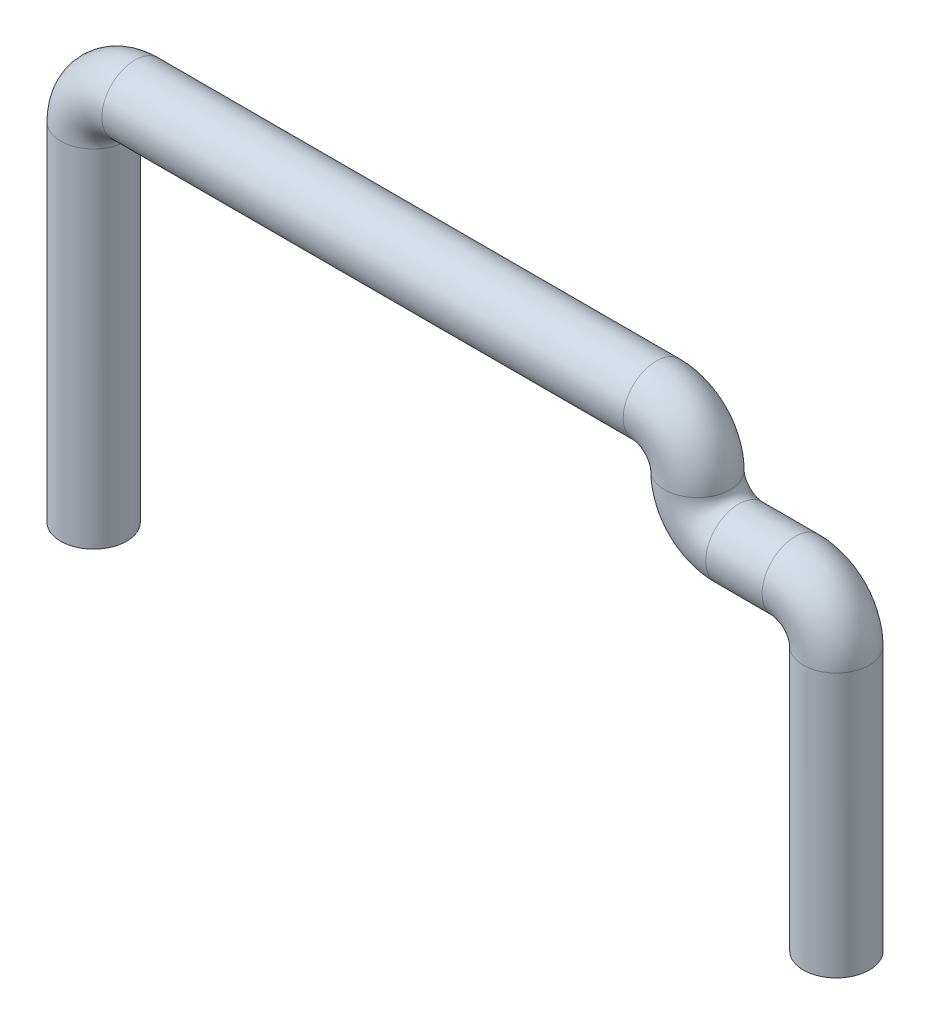
ISO-10303-21;
HEADER;
FILE_DESCRIPTION(('STEP AP214'),'2;1');
FILE_NAME('part.step','',(''),(''),'','','');
FILE_SCHEMA(('AUTOMOTIVE_DESIGN { 1 0 10303 214 1 1 1 1 }'));
ENDSEC;
DATA;
#1=APPLICATION_CONTEXT('core data for automotive mechanical design processes');
#2=APPLICATION_PROTOCOL_DEFINITION('international standard','automotive_design',2000,#1);
#3=PRODUCT_CONTEXT('',#1,'mechanical');
#4=PRODUCT('Part','Part','',(#3));
#5=PRODUCT_RELATED_PRODUCT_CATEGORY('part','',(#4));
#6=PRODUCT_DEFINITION_FORMATION('','',#4);
#7=PRODUCT_DEFINITION_CONTEXT('part definition',#1,'design');
#8=PRODUCT_DEFINITION('design','',#6,#7);
#9=PRODUCT_DEFINITION_SHAPE('','',#8);
#10=(LENGTH_UNIT() NAMED_UNIT(*) SI_UNIT(.MILLI.,.METRE.));
#11=(NAMED_UNIT(*) PLANE_ANGLE_UNIT() SI_UNIT($,.RADIAN.));
#12=(NAMED_UNIT(*) SI_UNIT($,.STERADIAN.) SOLID_ANGLE_UNIT());
#13=UNCERTAINTY_MEASURE_WITH_UNIT(LENGTH_MEASURE(1.E-05),#10,'distance_accuracy_value','');
#14=(GEOMETRIC_REPRESENTATION_CONTEXT(3) GLOBAL_UNCERTAINTY_ASSIGNED_CONTEXT((#13)) GLOBAL_UNIT_ASSIGNED_CONTEXT((#10,
#11,#12)) REPRESENTATION_CONTEXT('',''));
#15=CARTESIAN_POINT('',(0.,0.,0.));
#16=DIRECTION('',(0.,0.,1.));
#17=DIRECTION('',(1.,0.,0.));
#18=AXIS2_PLACEMENT_3D('',#15,#16,#17);
#19=CARTESIAN_POINT('',(3.17080544439415,0.,0.));
#20=DIRECTION('',(0.,1.,0.));
#21=DIRECTION('',(0.,0.,1.));
#22=AXIS2_PLACEMENT_3D('',#19,#20,#21);
#23=PLANE('',#22);
#24=CARTESIAN_POINT('',(3.17080544439415,0.,0.));
#25=DIRECTION('',(0.,-1.,0.));
#26=DIRECTION('',(0.,0.,-1.));
#27=AXIS2_PLACEMENT_3D('',#24,#25,#26);
#28=CIRCLE('',#27,0.4);
#29=CARTESIAN_POINT('',(3.17080544439415,0.,-0.4));
#30=VERTEX_POINT('',#29);
#31=EDGE_CURVE('E18',#30,#30,#28,.F.);
#32=ORIENTED_EDGE('',*,*,#31,.F.);
#33=EDGE_LOOP('',(#32));
#34=FACE_BOUND('',#33,.T.);
#35=ADVANCED_FACE('F15',(#34),#23,.F.);
#36=CARTESIAN_POINT('',(3.17080544439415,3.2,0.));
#37=DIRECTION('',(0.,-1.,0.));
#38=DIRECTION('',(0.,0.,-1.));
#39=AXIS2_PLACEMENT_3D('',#36,#37,#38);
#40=CYLINDRICAL_SURFACE('',#39,0.4);
#41=CARTESIAN_POINT('',(3.17080544439415,3.2,0.));
#42=DIRECTION('',(0.,-1.,0.));
#43=DIRECTION('',(1.,0.,0.));
#44=AXIS2_PLACEMENT_3D('',#41,#42,#43);
#45=CIRCLE('',#44,0.4);
#46=CARTESIAN_POINT('',(3.57080544439415,3.2,0.));
#47=VERTEX_POINT('',#46);
#48=EDGE_CURVE('E92',#47,#47,#45,.F.);
#49=ORIENTED_EDGE('',*,*,#48,.F.);
#50=EDGE_LOOP('',(#49));
#51=FACE_BOUND('',#50,.T.);
#52=ORIENTED_EDGE('',*,*,#31,.T.);
#53=EDGE_LOOP('',(#52));
#54=FACE_BOUND('',#53,.T.);
#55=ADVANCED_FACE('F85',(#51,#54),#40,.T.);
#56=CARTESIAN_POINT('',(2.67080544439415,3.2,0.));
#57=DIRECTION('',(0.,0.,-1.));
#58=DIRECTION('',(-1.,0.,0.));
#59=AXIS2_PLACEMENT_3D('',#56,#57,#58);
#60=TOROIDAL_SURFACE('',#59,0.5,0.4);
#61=CARTESIAN_POINT('',(2.67080544439415,3.7,0.));
#62=DIRECTION('',(1.,0.,0.));
#63=DIRECTION('',(0.,1.,0.));
#64=AXIS2_PLACEMENT_3D('',#61,#62,#63);
#65=CIRCLE('',#64,0.4);
#66=CARTESIAN_POINT('',(2.67080544439415,4.1,0.));
#67=VERTEX_POINT('',#66);
#68=EDGE_CURVE('E96',#67,#67,#65,.F.);
#69=ORIENTED_EDGE('',*,*,#68,.F.);
#70=EDGE_LOOP('',(#69));
#71=FACE_BOUND('',#70,.T.);
#72=ORIENTED_EDGE('',*,*,#48,.T.);
#73=EDGE_LOOP('',(#72));
#74=FACE_BOUND('',#73,.T.);
#75=ADVANCED_FACE('F81',(#71,#74),#60,.T.);
#76=CARTESIAN_POINT('',(1.98756574697502,3.7,0.));
#77=DIRECTION('',(1.,0.,0.));
#78=DIRECTION('',(0.,1.,0.));
#79=AXIS2_PLACEMENT_3D('',#76,#77,#78);
#80=CYLINDRICAL_SURFACE('',#79,0.4);
#81=CARTESIAN_POINT('',(1.98756574697501,3.7,0.));
#82=DIRECTION('',(1.,0.,0.));
#83=DIRECTION('',(0.,-1.,0.));
#84=AXIS2_PLACEMENT_3D('',#81,#82,#83);
#85=CIRCLE('',#84,0.4);
#86=CARTESIAN_POINT('',(1.987565746975,3.3,0.));
#87=VERTEX_POINT('',#86);
#88=EDGE_CURVE('E68',#87,#87,#85,.F.);
#89=ORIENTED_EDGE('',*,*,#88,.F.);
#90=EDGE_LOOP('',(#89));
#91=FACE_BOUND('',#90,.T.);
#92=ORIENTED_EDGE('',*,*,#68,.T.);
#93=EDGE_LOOP('',(#92));
#94=FACE_BOUND('',#93,.T.);
#95=ADVANCED_FACE('F77',(#91,#94),#80,.T.);
#96=CARTESIAN_POINT('',(-5.82919455560585,0.,0.));
#97=DIRECTION('',(0.,-1.,0.));
#98=DIRECTION('',(0.,0.,-1.));
#99=AXIS2_PLACEMENT_3D('',#96,#97,#98);
#100=PLANE('',#99);
#101=CARTESIAN_POINT('',(-5.82919455560585,0.,0.));
#102=DIRECTION('',(0.,1.,0.));
#103=DIRECTION('',(0.,0.,1.));
#104=AXIS2_PLACEMENT_3D('',#101,#102,#103);
#105=CIRCLE('',#104,0.4);
#106=CARTESIAN_POINT('',(-5.82919455560585,0.,0.4));
#107=VERTEX_POINT('',#106);
#108=EDGE_CURVE('E63',#107,#107,#105,.T.);
#109=ORIENTED_EDGE('',*,*,#108,.F.);
#110=EDGE_LOOP('',(#109));
#111=FACE_BOUND('',#110,.T.);
#112=ADVANCED_FACE('F73',(#111),#100,.T.);
#113=CARTESIAN_POINT('',(1.98756574697502,4.2,0.));
#114=DIRECTION('',(0.,0.,1.));
#115=DIRECTION('',(1.,0.,0.));
#116=AXIS2_PLACEMENT_3D('',#113,#114,#115);
#117=TOROIDAL_SURFACE('',#116,0.5,0.4);
#118=CARTESIAN_POINT('',(1.48756574697502,4.2,0.));
#119=DIRECTION('',(0.,-1.,0.));
#120=DIRECTION('',(1.,0.,0.));
#121=AXIS2_PLACEMENT_3D('',#118,#119,#120);
#122=CIRCLE('',#121,0.4);
#123=CARTESIAN_POINT('',(1.88756574697502,4.2,0.));
#124=VERTEX_POINT('',#123);
#125=EDGE_CURVE('E59',#124,#124,#122,.F.);
#126=ORIENTED_EDGE('',*,*,#125,.F.);
#127=EDGE_LOOP('',(#126));
#128=FACE_BOUND('',#127,.T.);
#129=ORIENTED_EDGE('',*,*,#88,.T.);
#130=EDGE_LOOP('',(#129));
#131=FACE_BOUND('',#130,.T.);
#132=ADVANCED_FACE('F70',(#128,#131),#117,.T.);
#133=CARTESIAN_POINT('',(-5.82919455560585,0.,0.));
#134=DIRECTION('',(0.,1.,0.));
#135=DIRECTION('',(0.,0.,1.));
#136=AXIS2_PLACEMENT_3D('',#133,#134,#135);
#137=CYLINDRICAL_SURFACE('',#136,0.4);
#138=ORIENTED_EDGE('',*,*,#108,.T.);
#139=EDGE_LOOP('',(#138));
#140=FACE_BOUND('',#139,.T.);
#141=CARTESIAN_POINT('',(-5.82919455560585,4.2,0.));
#142=DIRECTION('',(0.,1.,0.));
#143=DIRECTION('',(-1.,0.,0.));
#144=AXIS2_PLACEMENT_3D('',#141,#142,#143);
#145=CIRCLE('',#144,0.4);
#146=CARTESIAN_POINT('',(-6.22919455560585,4.2,0.));
#147=VERTEX_POINT('',#146);
#148=EDGE_CURVE('E32',#147,#147,#145,.T.);
#149=ORIENTED_EDGE('',*,*,#148,.F.);
#150=EDGE_LOOP('',(#149));
#151=FACE_BOUND('',#150,.T.);
#152=ADVANCED_FACE('F53',(#140,#151),#137,.T.);
#153=CARTESIAN_POINT('',(0.987565746975016,4.2,0.));
#154=DIRECTION('',(0.,0.,-1.));
#155=DIRECTION('',(-1.,0.,0.));
#156=AXIS2_PLACEMENT_3D('',#153,#154,#155);
#157=TOROIDAL_SURFACE('',#156,0.500000000000001,0.4);
#158=CARTESIAN_POINT('',(0.987565746975014,4.7,0.));
#159=DIRECTION('',(1.,0.,0.));
#160=DIRECTION('',(0.,1.,0.));
#161=AXIS2_PLACEMENT_3D('',#158,#159,#160);
#162=CIRCLE('',#161,0.4);
#163=CARTESIAN_POINT('',(0.987565746975014,5.1,0.));
#164=VERTEX_POINT('',#163);
#165=EDGE_CURVE('E23',#164,#164,#162,.F.);
#166=ORIENTED_EDGE('',*,*,#165,.F.);
#167=EDGE_LOOP('',(#166));
#168=FACE_BOUND('',#167,.T.);
#169=ORIENTED_EDGE('',*,*,#125,.T.);
#170=EDGE_LOOP('',(#169));
#171=FACE_BOUND('',#170,.T.);
#172=ADVANCED_FACE('F48',(#168,#171),#157,.T.);
#173=CARTESIAN_POINT('',(-5.32919455560585,4.2,0.));
#174=DIRECTION('',(0.,0.,-1.));
#175=DIRECTION('',(-1.,0.,0.));
#176=AXIS2_PLACEMENT_3D('',#173,#174,#175);
#177=TOROIDAL_SURFACE('',#176,0.5,0.4);
#178=ORIENTED_EDGE('',*,*,#148,.T.);
#179=EDGE_LOOP('',(#178));
#180=FACE_BOUND('',#179,.T.);
#181=CARTESIAN_POINT('',(-5.32919455560585,4.7,0.));
#182=DIRECTION('',(1.,0.,0.));
#183=DIRECTION('',(0.,1.,0.));
#184=AXIS2_PLACEMENT_3D('',#181,#182,#183);
#185=CIRCLE('',#184,0.4);
#186=CARTESIAN_POINT('',(-5.32919455560585,5.1,0.));
#187=VERTEX_POINT('',#186);
#188=EDGE_CURVE('E10',#187,#187,#185,.T.);
#189=ORIENTED_EDGE('',*,*,#188,.F.);
#190=EDGE_LOOP('',(#189));
#191=FACE_BOUND('',#190,.T.);
#192=ADVANCED_FACE('F43',(#180,#191),#177,.T.);
#193=CARTESIAN_POINT('',(-5.32919455560585,4.7,0.));
#194=DIRECTION('',(1.,0.,0.));
#195=DIRECTION('',(0.,1.,0.));
#196=AXIS2_PLACEMENT_3D('',#193,#194,#195);
#197=CYLINDRICAL_SURFACE('',#196,0.4);
#198=ORIENTED_EDGE('',*,*,#188,.T.);
#199=EDGE_LOOP('',(#198));
#200=FACE_BOUND('',#199,.T.);
#201=ORIENTED_EDGE('',*,*,#165,.T.);
#202=EDGE_LOOP('',(#201));
#203=FACE_BOUND('',#202,.T.);
#204=ADVANCED_FACE('F47',(#200,#203),#197,.T.);
#205=CLOSED_SHELL('',(#35,#55,#75,#95,#112,#132,#152,#172,#192,#204));
#206=MANIFOLD_SOLID_BREP('B1',#205);
#207=ADVANCED_BREP_SHAPE_REPRESENTATION('',(#18,#206),#14);
#208=SHAPE_DEFINITION_REPRESENTATION(#9,#207);
ENDSEC;
END-ISO-10303-21;
